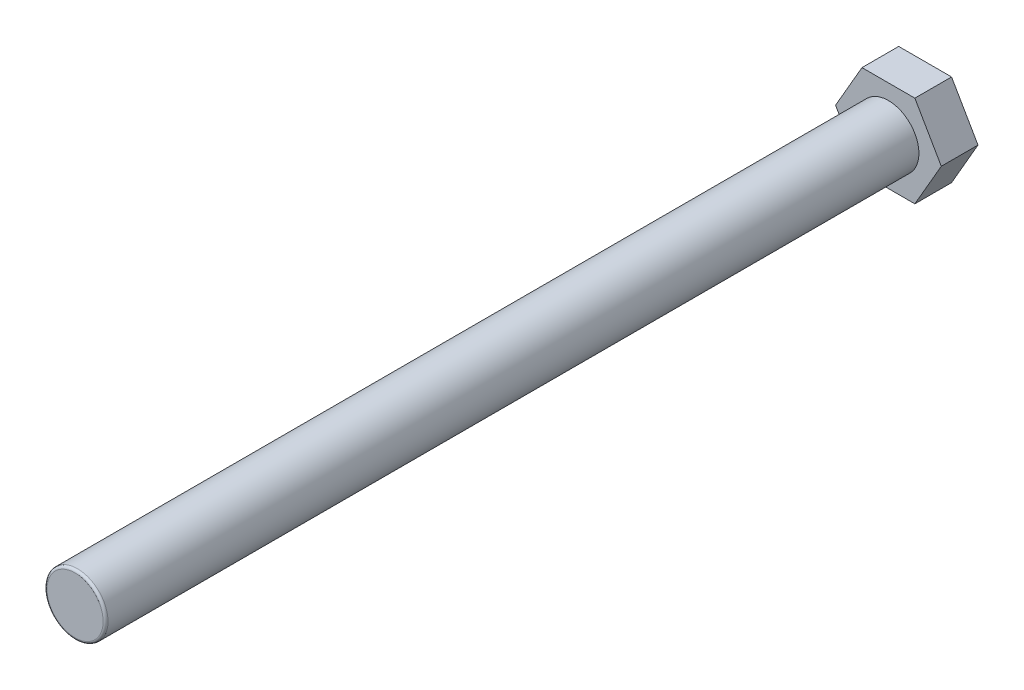
ISO-10303-21;
HEADER;
FILE_DESCRIPTION(('STEP AP214'),'2;1');
FILE_NAME('part.step','',(''),(''),'','','');
FILE_SCHEMA(('AUTOMOTIVE_DESIGN { 1 0 10303 214 1 1 1 1 }'));
ENDSEC;
DATA;
#1=APPLICATION_CONTEXT('core data for automotive mechanical design processes');
#2=APPLICATION_PROTOCOL_DEFINITION('international standard','automotive_design',2000,#1);
#3=PRODUCT_CONTEXT('',#1,'mechanical');
#4=PRODUCT('Part','Part','',(#3));
#5=PRODUCT_RELATED_PRODUCT_CATEGORY('part','',(#4));
#6=PRODUCT_DEFINITION_FORMATION('','',#4);
#7=PRODUCT_DEFINITION_CONTEXT('part definition',#1,'design');
#8=PRODUCT_DEFINITION('design','',#6,#7);
#9=PRODUCT_DEFINITION_SHAPE('','',#8);
#10=(LENGTH_UNIT() NAMED_UNIT(*) SI_UNIT(.MILLI.,.METRE.));
#11=(NAMED_UNIT(*) PLANE_ANGLE_UNIT() SI_UNIT($,.RADIAN.));
#12=(NAMED_UNIT(*) SI_UNIT($,.STERADIAN.) SOLID_ANGLE_UNIT());
#13=UNCERTAINTY_MEASURE_WITH_UNIT(LENGTH_MEASURE(1.E-05),#10,'distance_accuracy_value','');
#14=(GEOMETRIC_REPRESENTATION_CONTEXT(3) GLOBAL_UNCERTAINTY_ASSIGNED_CONTEXT((#13)) GLOBAL_UNIT_ASSIGNED_CONTEXT((#10,
#11,#12)) REPRESENTATION_CONTEXT('',''));
#15=CARTESIAN_POINT('',(0.,0.,0.));
#16=DIRECTION('',(0.,0.,1.));
#17=DIRECTION('',(1.,0.,0.));
#18=AXIS2_PLACEMENT_3D('',#15,#16,#17);
#19=CARTESIAN_POINT('',(12.8520866791741,13.2922264839932,0.));
#20=DIRECTION('',(0.,0.,1.));
#21=DIRECTION('',(1.,0.,0.));
#22=AXIS2_PLACEMENT_3D('',#19,#20,#21);
#23=PLANE('',#22);
#24=DIRECTION('',(0.5,-0.866025403784439,0.));
#25=VECTOR('',#24,1.);
#26=CARTESIAN_POINT('',(5.47696848941904,13.2922264839932,0.));
#27=LINE('',#26,#25);
#28=CARTESIAN_POINT('',(5.47696848941904,13.2922264839932,0.));
#29=VERTEX_POINT('',#28);
#30=CARTESIAN_POINT('',(9.16452758429654,6.90518677575267,0.));
#31=VERTEX_POINT('',#30);
#32=EDGE_CURVE('E331',#29,#31,#27,.T.);
#33=ORIENTED_EDGE('',*,*,#32,.F.);
#34=DIRECTION('',(-0.499999999999999,-0.866025403784439,0.));
#35=VECTOR('',#34,1.);
#36=CARTESIAN_POINT('',(9.16452758429654,19.6792661922338,0.));
#37=LINE('',#36,#35);
#38=CARTESIAN_POINT('',(9.16452758429654,19.6792661922338,0.));
#39=VERTEX_POINT('',#38);
#40=EDGE_CURVE('E78',#39,#29,#37,.T.);
#41=ORIENTED_EDGE('',*,*,#40,.F.);
#42=DIRECTION('',(1.,0.,0.));
#43=VECTOR('',#42,1.);
#44=CARTESIAN_POINT('',(10.7883366791741,19.6792661922338,0.));
#45=LINE('',#44,#43);
#46=CARTESIAN_POINT('',(16.5396457740516,19.6792661922338,0.));
#47=VERTEX_POINT('',#46);
#48=EDGE_CURVE('E60',#47,#39,#45,.F.);
#49=ORIENTED_EDGE('',*,*,#48,.F.);
#50=DIRECTION('',(-0.5,0.866025403784439,0.));
#51=VECTOR('',#50,1.);
#52=CARTESIAN_POINT('',(20.2272048689291,13.2922264839932,0.));
#53=LINE('',#52,#51);
#54=CARTESIAN_POINT('',(20.2272048689291,13.2922264839932,0.));
#55=VERTEX_POINT('',#54);
#56=EDGE_CURVE('E66',#55,#47,#53,.T.);
#57=ORIENTED_EDGE('',*,*,#56,.F.);
#58=DIRECTION('',(0.500000000000001,0.866025403784438,0.));
#59=VECTOR('',#58,1.);
#60=CARTESIAN_POINT('',(16.5396457740515,6.90518677575267,0.));
#61=LINE('',#60,#59);
#62=CARTESIAN_POINT('',(16.5396457740515,6.90518677575267,0.));
#63=VERTEX_POINT('',#62);
#64=EDGE_CURVE('E367',#63,#55,#61,.T.);
#65=ORIENTED_EDGE('',*,*,#64,.F.);
#66=DIRECTION('',(1.,0.,0.));
#67=VECTOR('',#66,1.);
#68=CARTESIAN_POINT('',(14.9158366791741,6.90518677575267,0.));
#69=LINE('',#68,#67);
#70=EDGE_CURVE('E372',#31,#63,#69,.T.);
#71=ORIENTED_EDGE('',*,*,#70,.F.);
#72=EDGE_LOOP('',(#33,#41,#49,#57,#65,#71));
#73=FACE_BOUND('',#72,.T.);
#74=ADVANCED_FACE('F16',(#73),#23,.F.);
#75=CARTESIAN_POINT('',(17.6815060003322,18.4635062651736,0.219970452561238));
#76=DIRECTION('',(0.433012701892219,0.25,-0.866025403784439));
#77=DIRECTION('',(-0.894427190999916,0.,-0.447213595499958));
#78=AXIS2_PLACEMENT_3D('',#75,#76,#77);
#79=PLANE('',#78);
#80=DIRECTION('',(-0.447213595499959,-0.774596669241483,-0.447213595499957));
#81=VECTOR('',#80,1.);
#82=CARTESIAN_POINT('',(16.9795866791741,20.4412661922338,0.439940905122489));
#83=LINE('',#82,#81);
#84=CARTESIAN_POINT('',(16.9795866791741,20.4412661922338,0.439940905122492));
#85=VERTEX_POINT('',#84);
#86=EDGE_CURVE('E69',#85,#47,#83,.T.);
#87=ORIENTED_EDGE('',*,*,#86,.F.);
#88=DIRECTION('',(-0.5,0.866025403784439,0.));
#89=VECTOR('',#88,1.);
#90=CARTESIAN_POINT('',(16.9795866791741,20.4412661922338,0.439940905122501));
#91=LINE('',#90,#89);
#92=CARTESIAN_POINT('',(21.1070866791741,13.2922264839932,0.439940905122492));
#93=VERTEX_POINT('',#92);
#94=EDGE_CURVE('E364',#93,#85,#91,.T.);
#95=ORIENTED_EDGE('',*,*,#94,.F.);
#96=DIRECTION('',(-0.894427190999917,0.,-0.447213595499956));
#97=VECTOR('',#96,1.);
#98=CARTESIAN_POINT('',(19.9296339550761,13.2922264839932,-0.148785456926514));
#99=LINE('',#98,#97);
#100=EDGE_CURVE('E72',#55,#93,#99,.F.);
#101=ORIENTED_EDGE('',*,*,#100,.F.);
#102=ORIENTED_EDGE('',*,*,#56,.T.);
#103=EDGE_LOOP('',(#87,#95,#101,#102));
#104=FACE_BOUND('',#103,.T.);
#105=ADVANCED_FACE('F67',(#104),#79,.T.);
#106=CARTESIAN_POINT('',(10.7883366791741,20.0602661922338,0.219970452561238));
#107=DIRECTION('',(0.,0.5,-0.866025403784439));
#108=DIRECTION('',(0.,0.866025403784439,0.5));
#109=AXIS2_PLACEMENT_3D('',#106,#107,#108);
#110=PLANE('',#109);
#111=DIRECTION('',(0.447213595499947,-0.774596669241492,-0.447213595499955));
#112=VECTOR('',#111,1.);
#113=CARTESIAN_POINT('',(8.72458667917406,20.4412661922338,0.439940905122484));
#114=LINE('',#113,#112);
#115=CARTESIAN_POINT('',(8.72458667917406,20.4412661922338,0.439940905122491));
#116=VERTEX_POINT('',#115);
#117=EDGE_CURVE('E80',#116,#39,#114,.T.);
#118=ORIENTED_EDGE('',*,*,#117,.F.);
#119=DIRECTION('',(1.,0.,0.));
#120=VECTOR('',#119,1.);
#121=CARTESIAN_POINT('',(8.72458667917406,20.4412661922338,0.439940905122501));
#122=LINE('',#121,#120);
#123=EDGE_CURVE('E84',#85,#116,#122,.F.);
#124=ORIENTED_EDGE('',*,*,#123,.F.);
#125=ORIENTED_EDGE('',*,*,#86,.T.);
#126=ORIENTED_EDGE('',*,*,#48,.T.);
#127=EDGE_LOOP('',(#118,#124,#125,#126));
#128=FACE_BOUND('',#127,.T.);
#129=ADVANCED_FACE('F82',(#128),#110,.T.);
#130=CARTESIAN_POINT('',(5.95891735801592,14.8889864110533,0.219970452561238));
#131=DIRECTION('',(-0.433012701892219,0.25,-0.866025403784439));
#132=DIRECTION('',(-0.894427190999916,0.,0.447213595499957));
#133=AXIS2_PLACEMENT_3D('',#130,#131,#132);
#134=PLANE('',#133);
#135=DIRECTION('',(-0.894427190999915,0.,0.447213595499959));
#136=VECTOR('',#135,1.);
#137=CARTESIAN_POINT('',(7.42553940327205,13.2922264839932,-0.974285456926507));
#138=LINE('',#137,#136);
#139=CARTESIAN_POINT('',(4.59708667917406,13.2922264839932,0.439940905122488));
#140=VERTEX_POINT('',#139);
#141=EDGE_CURVE('E324',#140,#29,#138,.F.);
#142=ORIENTED_EDGE('',*,*,#141,.F.);
#143=DIRECTION('',(-0.5,-0.866025403784439,0.));
#144=VECTOR('',#143,1.);
#145=CARTESIAN_POINT('',(4.59708667917407,13.2922264839932,0.439940905122501));
#146=LINE('',#145,#144);
#147=EDGE_CURVE('E328',#116,#140,#146,.T.);
#148=ORIENTED_EDGE('',*,*,#147,.F.);
#149=ORIENTED_EDGE('',*,*,#117,.T.);
#150=ORIENTED_EDGE('',*,*,#40,.T.);
#151=EDGE_LOOP('',(#142,#148,#149,#150));
#152=FACE_BOUND('',#151,.T.);
#153=ADVANCED_FACE('F254',(#152),#134,.T.);
#154=CARTESIAN_POINT('',(8.02266735801592,8.12094670281282,0.219970452561238));
#155=DIRECTION('',(-0.43301270189222,-0.25,-0.866025403784438));
#156=DIRECTION('',(-0.894427190999915,0.,0.447213595499959));
#157=AXIS2_PLACEMENT_3D('',#154,#155,#156);
#158=PLANE('',#157);
#159=ORIENTED_EDGE('',*,*,#141,.T.);
#160=ORIENTED_EDGE('',*,*,#32,.T.);
#161=DIRECTION('',(0.447213595499941,0.774596669241491,-0.447213595499962));
#162=VECTOR('',#161,1.);
#163=CARTESIAN_POINT('',(8.72458667917406,6.14318677575267,0.43994090512249));
#164=LINE('',#163,#162);
#165=CARTESIAN_POINT('',(8.72458667917406,6.14318677575267,0.43994090512249));
#166=VERTEX_POINT('',#165);
#167=EDGE_CURVE('E337',#166,#31,#164,.T.);
#168=ORIENTED_EDGE('',*,*,#167,.F.);
#169=DIRECTION('',(0.5,-0.866025403784439,0.));
#170=VECTOR('',#169,1.);
#171=CARTESIAN_POINT('',(8.72458667917406,6.14318677575268,0.439940905122501));
#172=LINE('',#171,#170);
#173=EDGE_CURVE('E335',#140,#166,#172,.T.);
#174=ORIENTED_EDGE('',*,*,#173,.F.);
#175=EDGE_LOOP('',(#159,#160,#168,#174));
#176=FACE_BOUND('',#175,.T.);
#177=ADVANCED_FACE('F246',(#176),#158,.T.);
#178=CARTESIAN_POINT('',(14.9158366791741,6.52418677575268,0.219970452561238));
#179=DIRECTION('',(0.,-0.5,-0.866025403784439));
#180=DIRECTION('',(0.,0.866025403784439,-0.5));
#181=AXIS2_PLACEMENT_3D('',#178,#179,#180);
#182=PLANE('',#181);
#183=ORIENTED_EDGE('',*,*,#167,.T.);
#184=ORIENTED_EDGE('',*,*,#70,.T.);
#185=DIRECTION('',(-0.447213595499962,0.774596669241481,-0.447213595499958));
#186=VECTOR('',#185,1.);
#187=CARTESIAN_POINT('',(16.979586679174,6.14318677575267,0.439940905122487));
#188=LINE('',#187,#186);
#189=CARTESIAN_POINT('',(16.979586679174,6.14318677575267,0.439940905122491));
#190=VERTEX_POINT('',#189);
#191=EDGE_CURVE('E369',#190,#63,#188,.T.);
#192=ORIENTED_EDGE('',*,*,#191,.F.);
#193=DIRECTION('',(1.,0.,0.));
#194=VECTOR('',#193,1.);
#195=CARTESIAN_POINT('',(16.979586679174,6.14318677575268,0.439940905122501));
#196=LINE('',#195,#194);
#197=EDGE_CURVE('E353',#166,#190,#196,.T.);
#198=ORIENTED_EDGE('',*,*,#197,.F.);
#199=EDGE_LOOP('',(#183,#184,#192,#198));
#200=FACE_BOUND('',#199,.T.);
#201=ADVANCED_FACE('F238',(#200),#182,.T.);
#202=CARTESIAN_POINT('',(19.7452560003322,11.6954665569331,0.219970452561238));
#203=DIRECTION('',(0.433012701892218,-0.25,-0.866025403784439));
#204=DIRECTION('',(-0.894427190999917,0.,-0.447213595499956));
#205=AXIS2_PLACEMENT_3D('',#202,#203,#204);
#206=PLANE('',#205);
#207=ORIENTED_EDGE('',*,*,#100,.T.);
#208=DIRECTION('',(0.500000000000001,0.866025403784438,0.));
#209=VECTOR('',#208,1.);
#210=CARTESIAN_POINT('',(21.1070866791741,13.2922264839932,0.439940905122501));
#211=LINE('',#210,#209);
#212=EDGE_CURVE('E402',#190,#93,#211,.T.);
#213=ORIENTED_EDGE('',*,*,#212,.F.);
#214=ORIENTED_EDGE('',*,*,#191,.T.);
#215=ORIENTED_EDGE('',*,*,#64,.T.);
#216=EDGE_LOOP('',(#207,#213,#214,#215));
#217=FACE_BOUND('',#216,.T.);
#218=ADVANCED_FACE('F230',(#217),#206,.T.);
#219=CARTESIAN_POINT('',(16.9795866791741,20.4412661922338,0.));
#220=DIRECTION('',(0.866025403784439,0.5,0.));
#221=DIRECTION('',(-0.5,0.866025403784439,0.));
#222=AXIS2_PLACEMENT_3D('',#219,#220,#221);
#223=PLANE('',#222);
#224=DIRECTION('',(-0.500000000000001,0.866025403784438,0.));
#225=VECTOR('',#224,1.);
#226=CARTESIAN_POINT('',(21.1070866791741,13.2922264839932,6.1722));
#227=LINE('',#226,#225);
#228=CARTESIAN_POINT('',(21.1070866791741,13.2922264839932,6.1722));
#229=VERTEX_POINT('',#228);
#230=CARTESIAN_POINT('',(16.9795866791741,20.4412661922338,6.1722));
#231=VERTEX_POINT('',#230);
#232=EDGE_CURVE('E116',#229,#231,#227,.T.);
#233=ORIENTED_EDGE('',*,*,#232,.F.);
#234=DIRECTION('',(0.,0.,1.));
#235=VECTOR('',#234,1.);
#236=CARTESIAN_POINT('',(21.1070866791741,13.2922264839932,0.));
#237=LINE('',#236,#235);
#238=EDGE_CURVE('E397',#93,#229,#237,.T.);
#239=ORIENTED_EDGE('',*,*,#238,.F.);
#240=ORIENTED_EDGE('',*,*,#94,.T.);
#241=DIRECTION('',(0.,0.,1.));
#242=VECTOR('',#241,1.);
#243=CARTESIAN_POINT('',(16.9795866791741,20.4412661922338,0.));
#244=LINE('',#243,#242);
#245=EDGE_CURVE('E351',#231,#85,#244,.F.);
#246=ORIENTED_EDGE('',*,*,#245,.F.);
#247=EDGE_LOOP('',(#233,#239,#240,#246));
#248=FACE_BOUND('',#247,.T.);
#249=ADVANCED_FACE('F222',(#248),#223,.T.);
#250=CARTESIAN_POINT('',(8.72458667917406,20.4412661922338,0.));
#251=DIRECTION('',(0.,1.,0.));
#252=DIRECTION('',(0.,0.,1.));
#253=AXIS2_PLACEMENT_3D('',#250,#251,#252);
#254=PLANE('',#253);
#255=DIRECTION('',(1.,0.,0.));
#256=VECTOR('',#255,1.);
#257=CARTESIAN_POINT('',(12.8520866791741,20.4412661922338,6.1722));
#258=LINE('',#257,#256);
#259=CARTESIAN_POINT('',(8.72458667917406,20.4412661922338,6.1722));
#260=VERTEX_POINT('',#259);
#261=EDGE_CURVE('E113',#231,#260,#258,.F.);
#262=ORIENTED_EDGE('',*,*,#261,.F.);
#263=ORIENTED_EDGE('',*,*,#245,.T.);
#264=ORIENTED_EDGE('',*,*,#123,.T.);
#265=DIRECTION('',(0.,0.,1.));
#266=VECTOR('',#265,1.);
#267=CARTESIAN_POINT('',(8.72458667917407,20.4412661922338,0.));
#268=LINE('',#267,#266);
#269=EDGE_CURVE('E343',#260,#116,#268,.F.);
#270=ORIENTED_EDGE('',*,*,#269,.F.);
#271=EDGE_LOOP('',(#262,#263,#264,#270));
#272=FACE_BOUND('',#271,.T.);
#273=ADVANCED_FACE('F214',(#272),#254,.T.);
#274=CARTESIAN_POINT('',(4.59708667917407,13.2922264839932,0.));
#275=DIRECTION('',(-0.866025403784439,0.5,0.));
#276=DIRECTION('',(-0.5,-0.866025403784439,0.));
#277=AXIS2_PLACEMENT_3D('',#274,#275,#276);
#278=PLANE('',#277);
#279=DIRECTION('',(-0.5,-0.866025403784439,0.));
#280=VECTOR('',#279,1.);
#281=CARTESIAN_POINT('',(8.72458667917406,20.4412661922338,6.1722));
#282=LINE('',#281,#280);
#283=CARTESIAN_POINT('',(4.59708667917407,13.2922264839932,6.1722));
#284=VERTEX_POINT('',#283);
#285=EDGE_CURVE('E110',#260,#284,#282,.T.);
#286=ORIENTED_EDGE('',*,*,#285,.F.);
#287=ORIENTED_EDGE('',*,*,#269,.T.);
#288=ORIENTED_EDGE('',*,*,#147,.T.);
#289=DIRECTION('',(0.,0.,1.));
#290=VECTOR('',#289,1.);
#291=CARTESIAN_POINT('',(4.59708667917407,13.2922264839932,0.));
#292=LINE('',#291,#290);
#293=EDGE_CURVE('E342',#284,#140,#292,.F.);
#294=ORIENTED_EDGE('',*,*,#293,.F.);
#295=EDGE_LOOP('',(#286,#287,#288,#294));
#296=FACE_BOUND('',#295,.T.);
#297=ADVANCED_FACE('F206',(#296),#278,.T.);
#298=CARTESIAN_POINT('',(8.72458667917406,6.14318677575268,0.));
#299=DIRECTION('',(-0.866025403784439,-0.5,0.));
#300=DIRECTION('',(0.5,-0.866025403784439,0.));
#301=AXIS2_PLACEMENT_3D('',#298,#299,#300);
#302=PLANE('',#301);
#303=DIRECTION('',(0.500000000000001,-0.866025403784438,0.));
#304=VECTOR('',#303,1.);
#305=CARTESIAN_POINT('',(4.59708667917406,13.2922264839932,6.1722));
#306=LINE('',#305,#304);
#307=CARTESIAN_POINT('',(8.72458667917406,6.14318677575268,6.1722));
#308=VERTEX_POINT('',#307);
#309=EDGE_CURVE('E103',#284,#308,#306,.T.);
#310=ORIENTED_EDGE('',*,*,#309,.F.);
#311=ORIENTED_EDGE('',*,*,#293,.T.);
#312=ORIENTED_EDGE('',*,*,#173,.T.);
#313=DIRECTION('',(0.,0.,-1.));
#314=VECTOR('',#313,1.);
#315=CARTESIAN_POINT('',(8.72458667917406,6.14318677575268,0.));
#316=LINE('',#315,#314);
#317=EDGE_CURVE('E356',#308,#166,#316,.T.);
#318=ORIENTED_EDGE('',*,*,#317,.F.);
#319=EDGE_LOOP('',(#310,#311,#312,#318));
#320=FACE_BOUND('',#319,.T.);
#321=ADVANCED_FACE('F199',(#320),#302,.T.);
#322=CARTESIAN_POINT('',(16.979586679174,6.14318677575268,0.));
#323=DIRECTION('',(0.,-1.,0.));
#324=DIRECTION('',(0.,0.,-1.));
#325=AXIS2_PLACEMENT_3D('',#322,#323,#324);
#326=PLANE('',#325);
#327=DIRECTION('',(1.,0.,0.));
#328=VECTOR('',#327,1.);
#329=CARTESIAN_POINT('',(12.8520866791741,6.14318677575268,6.1722));
#330=LINE('',#329,#328);
#331=CARTESIAN_POINT('',(16.979586679174,6.14318677575268,6.1722));
#332=VERTEX_POINT('',#331);
#333=EDGE_CURVE('E96',#308,#332,#330,.T.);
#334=ORIENTED_EDGE('',*,*,#333,.F.);
#335=ORIENTED_EDGE('',*,*,#317,.T.);
#336=ORIENTED_EDGE('',*,*,#197,.T.);
#337=DIRECTION('',(0.,0.,1.));
#338=VECTOR('',#337,1.);
#339=CARTESIAN_POINT('',(16.979586679174,6.14318677575267,0.));
#340=LINE('',#339,#338);
#341=EDGE_CURVE('E150',#332,#190,#340,.F.);
#342=ORIENTED_EDGE('',*,*,#341,.F.);
#343=EDGE_LOOP('',(#334,#335,#336,#342));
#344=FACE_BOUND('',#343,.T.);
#345=ADVANCED_FACE('F192',(#344),#326,.T.);
#346=CARTESIAN_POINT('',(21.1070866791741,13.2922264839932,0.));
#347=DIRECTION('',(0.866025403784438,-0.500000000000001,0.));
#348=DIRECTION('',(0.500000000000001,0.866025403784438,0.));
#349=AXIS2_PLACEMENT_3D('',#346,#347,#348);
#350=PLANE('',#349);
#351=DIRECTION('',(0.500000000000001,0.866025403784438,0.));
#352=VECTOR('',#351,1.);
#353=CARTESIAN_POINT('',(16.979586679174,6.14318677575268,6.1722));
#354=LINE('',#353,#352);
#355=EDGE_CURVE('E93',#332,#229,#354,.T.);
#356=ORIENTED_EDGE('',*,*,#355,.F.);
#357=ORIENTED_EDGE('',*,*,#341,.T.);
#358=ORIENTED_EDGE('',*,*,#212,.T.);
#359=ORIENTED_EDGE('',*,*,#238,.T.);
#360=EDGE_LOOP('',(#356,#357,#358,#359));
#361=FACE_BOUND('',#360,.T.);
#362=ADVANCED_FACE('F136',(#361),#350,.T.);
#363=CARTESIAN_POINT('',(12.8520866791741,13.2922264839932,133.1722));
#364=DIRECTION('',(0.,0.,-1.));
#365=DIRECTION('',(-1.,0.,0.));
#366=AXIS2_PLACEMENT_3D('',#363,#364,#365);
#367=PLANE('',#366);
#368=CARTESIAN_POINT('',(12.8520866791741,13.2922264839932,133.1722));
#369=DIRECTION('',(0.,0.,-1.));
#370=DIRECTION('',(-1.,0.,0.));
#371=AXIS2_PLACEMENT_3D('',#368,#369,#370);
#372=CIRCLE('',#371,4.3815);
#373=CARTESIAN_POINT('',(8.47058667917407,13.2922264839932,133.1722));
#374=VERTEX_POINT('',#373);
#375=CARTESIAN_POINT('',(17.2335866791741,13.2922264839932,133.1722));
#376=VERTEX_POINT('',#375);
#377=EDGE_CURVE('E35',#374,#376,#372,.T.);
#378=ORIENTED_EDGE('',*,*,#377,.F.);
#379=CARTESIAN_POINT('',(12.8520866791741,13.2922264839932,133.1722));
#380=DIRECTION('',(0.,0.,-1.));
#381=DIRECTION('',(1.,0.,0.));
#382=AXIS2_PLACEMENT_3D('',#379,#380,#381);
#383=CIRCLE('',#382,4.3815);
#384=EDGE_CURVE('E90',#376,#374,#383,.T.);
#385=ORIENTED_EDGE('',*,*,#384,.F.);
#386=EDGE_LOOP('',(#378,#385));
#387=FACE_BOUND('',#386,.T.);
#388=ADVANCED_FACE('F125',(#387),#367,.F.);
#389=CARTESIAN_POINT('',(12.8520866791741,13.2922264839932,6.1722));
#390=DIRECTION('',(0.,0.,1.));
#391=DIRECTION('',(1.,0.,0.));
#392=AXIS2_PLACEMENT_3D('',#389,#390,#391);
#393=PLANE('',#392);
#394=CARTESIAN_POINT('',(12.8520866791741,13.2922264839932,6.1722));
#395=DIRECTION('',(0.,0.,1.));
#396=DIRECTION('',(1.,0.,0.));
#397=AXIS2_PLACEMENT_3D('',#394,#395,#396);
#398=CIRCLE('',#397,4.7625);
#399=CARTESIAN_POINT('',(17.6145866791741,13.2922264839932,6.1722));
#400=VERTEX_POINT('',#399);
#401=EDGE_CURVE('E27',#400,#400,#398,.T.);
#402=ORIENTED_EDGE('',*,*,#401,.F.);
#403=EDGE_LOOP('',(#402));
#404=FACE_BOUND('',#403,.T.);
#405=ORIENTED_EDGE('',*,*,#333,.T.);
#406=ORIENTED_EDGE('',*,*,#355,.T.);
#407=ORIENTED_EDGE('',*,*,#232,.T.);
#408=ORIENTED_EDGE('',*,*,#261,.T.);
#409=ORIENTED_EDGE('',*,*,#285,.T.);
#410=ORIENTED_EDGE('',*,*,#309,.T.);
#411=EDGE_LOOP('',(#405,#406,#407,#408,#409,#410));
#412=FACE_BOUND('',#411,.T.);
#413=ADVANCED_FACE('F135',(#404,#412),#393,.T.);
#414=CARTESIAN_POINT('',(12.8520866791741,13.2922264839932,132.7912));
#415=DIRECTION('',(0.,0.,-1.));
#416=DIRECTION('',(-1.,0.,0.));
#417=AXIS2_PLACEMENT_3D('',#414,#415,#416);
#418=TOROIDAL_SURFACE('',#417,4.3815,0.381);
#419=ORIENTED_EDGE('',*,*,#384,.T.);
#420=ORIENTED_EDGE('',*,*,#377,.T.);
#421=EDGE_LOOP('',(#419,#420));
#422=FACE_BOUND('',#421,.T.);
#423=CARTESIAN_POINT('',(12.8520866791741,13.2922264839932,132.7912));
#424=DIRECTION('',(0.,0.,1.));
#425=DIRECTION('',(1.,0.,0.));
#426=AXIS2_PLACEMENT_3D('',#423,#424,#425);
#427=CIRCLE('',#426,4.7625);
#428=CARTESIAN_POINT('',(17.6145866791741,13.2922264839932,132.7912));
#429=VERTEX_POINT('',#428);
#430=EDGE_CURVE('E10',#429,#429,#427,.F.);
#431=ORIENTED_EDGE('',*,*,#430,.F.);
#432=EDGE_LOOP('',(#431));
#433=FACE_BOUND('',#432,.T.);
#434=ADVANCED_FACE('F152',(#422,#433),#418,.T.);
#435=CARTESIAN_POINT('',(12.8520866791741,13.2922264839932,6.1722));
#436=DIRECTION('',(0.,0.,1.));
#437=DIRECTION('',(1.,0.,0.));
#438=AXIS2_PLACEMENT_3D('',#435,#436,#437);
#439=CYLINDRICAL_SURFACE('',#438,4.7625);
#440=ORIENTED_EDGE('',*,*,#401,.T.);
#441=EDGE_LOOP('',(#440));
#442=FACE_BOUND('',#441,.T.);
#443=ORIENTED_EDGE('',*,*,#430,.T.);
#444=EDGE_LOOP('',(#443));
#445=FACE_BOUND('',#444,.T.);
#446=ADVANCED_FACE('F161',(#442,#445),#439,.T.);
#447=CLOSED_SHELL('',(#74,#105,#129,#153,#177,#201,#218,#249,#273,#297,#321,#345,#362,#388,#413,
#434,#446));
#448=MANIFOLD_SOLID_BREP('B1',#447);
#449=ADVANCED_BREP_SHAPE_REPRESENTATION('',(#18,#448),#14);
#450=SHAPE_DEFINITION_REPRESENTATION(#9,#449);
ENDSEC;
END-ISO-10303-21;
